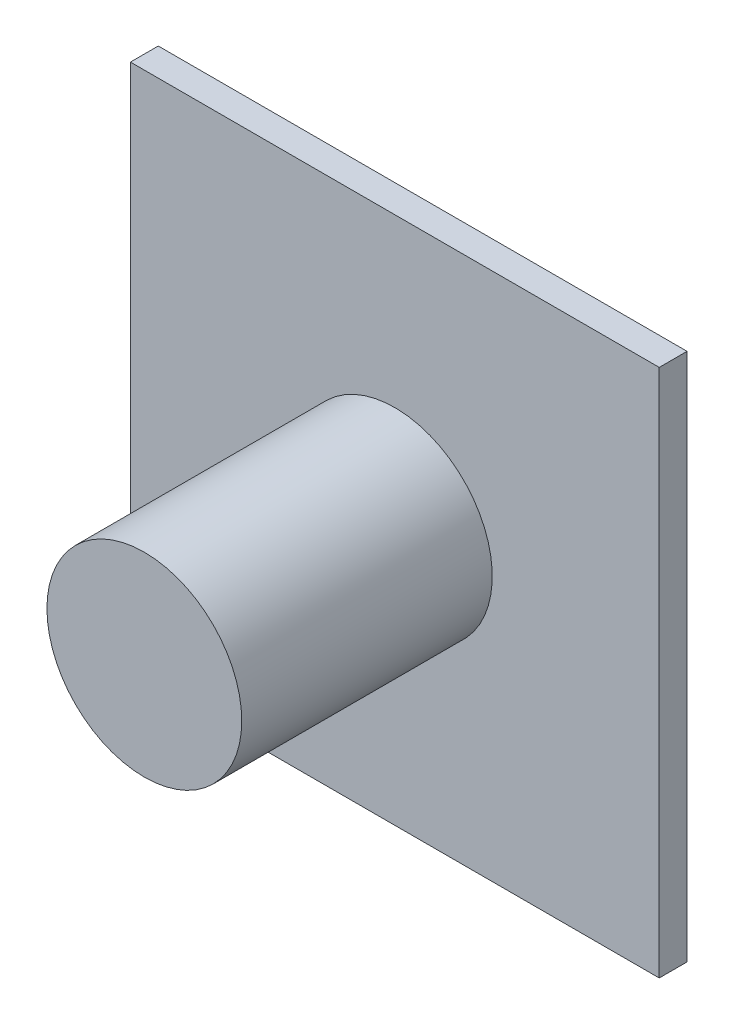
ISO-10303-21;
HEADER;
FILE_DESCRIPTION(('STEP AP214'),'2;1');
FILE_NAME('part.step','',(''),(''),'','','');
FILE_SCHEMA(('AUTOMOTIVE_DESIGN { 1 0 10303 214 1 1 1 1 }'));
ENDSEC;
DATA;
#1=APPLICATION_CONTEXT('core data for automotive mechanical design processes');
#2=APPLICATION_PROTOCOL_DEFINITION('international standard','automotive_design',2000,#1);
#3=PRODUCT_CONTEXT('',#1,'mechanical');
#4=PRODUCT('Part','Part','',(#3));
#5=PRODUCT_RELATED_PRODUCT_CATEGORY('part','',(#4));
#6=PRODUCT_DEFINITION_FORMATION('','',#4);
#7=PRODUCT_DEFINITION_CONTEXT('part definition',#1,'design');
#8=PRODUCT_DEFINITION('design','',#6,#7);
#9=PRODUCT_DEFINITION_SHAPE('','',#8);
#10=(LENGTH_UNIT() NAMED_UNIT(*) SI_UNIT(.MILLI.,.METRE.));
#11=(NAMED_UNIT(*) PLANE_ANGLE_UNIT() SI_UNIT($,.RADIAN.));
#12=(NAMED_UNIT(*) SI_UNIT($,.STERADIAN.) SOLID_ANGLE_UNIT());
#13=UNCERTAINTY_MEASURE_WITH_UNIT(LENGTH_MEASURE(1.E-05),#10,'distance_accuracy_value','');
#14=(GEOMETRIC_REPRESENTATION_CONTEXT(3) GLOBAL_UNCERTAINTY_ASSIGNED_CONTEXT((#13)) GLOBAL_UNIT_ASSIGNED_CONTEXT((#10,
#11,#12)) REPRESENTATION_CONTEXT('',''));
#15=CARTESIAN_POINT('',(0.,0.,0.));
#16=DIRECTION('',(0.,0.,1.));
#17=DIRECTION('',(1.,0.,0.));
#18=AXIS2_PLACEMENT_3D('',#15,#16,#17);
#19=CARTESIAN_POINT('',(19.,-19.,2.));
#20=DIRECTION('',(-1.,0.,0.));
#21=DIRECTION('',(0.,0.,1.));
#22=AXIS2_PLACEMENT_3D('',#19,#20,#21);
#23=PLANE('',#22);
#24=DIRECTION('',(0.,1.,0.));
#25=VECTOR('',#24,1.);
#26=CARTESIAN_POINT('',(19.,-19.,0.));
#27=LINE('',#26,#25);
#28=CARTESIAN_POINT('',(19.,-19.,0.));
#29=VERTEX_POINT('',#28);
#30=CARTESIAN_POINT('',(19.,19.,0.));
#31=VERTEX_POINT('',#30);
#32=EDGE_CURVE('E99',#29,#31,#27,.T.);
#33=ORIENTED_EDGE('',*,*,#32,.T.);
#34=DIRECTION('',(0.,0.,-1.));
#35=VECTOR('',#34,1.);
#36=CARTESIAN_POINT('',(19.,19.,2.));
#37=LINE('',#36,#35);
#38=CARTESIAN_POINT('',(19.,19.,2.));
#39=VERTEX_POINT('',#38);
#40=EDGE_CURVE('E36',#39,#31,#37,.T.);
#41=ORIENTED_EDGE('',*,*,#40,.F.);
#42=DIRECTION('',(0.,1.,0.));
#43=VECTOR('',#42,1.);
#44=CARTESIAN_POINT('',(19.,-19.,2.));
#45=LINE('',#44,#43);
#46=CARTESIAN_POINT('',(19.,-19.,2.));
#47=VERTEX_POINT('',#46);
#48=EDGE_CURVE('E86',#47,#39,#45,.T.);
#49=ORIENTED_EDGE('',*,*,#48,.F.);
#50=DIRECTION('',(0.,0.,-1.));
#51=VECTOR('',#50,1.);
#52=CARTESIAN_POINT('',(19.,-19.,2.));
#53=LINE('',#52,#51);
#54=EDGE_CURVE('E95',#47,#29,#53,.T.);
#55=ORIENTED_EDGE('',*,*,#54,.T.);
#56=EDGE_LOOP('',(#33,#41,#49,#55));
#57=FACE_BOUND('',#56,.T.);
#58=ADVANCED_FACE('F33',(#57),#23,.F.);
#59=CARTESIAN_POINT('',(-19.,19.,2.));
#60=DIRECTION('',(0.,-1.,0.));
#61=DIRECTION('',(0.,0.,-1.));
#62=AXIS2_PLACEMENT_3D('',#59,#60,#61);
#63=PLANE('',#62);
#64=DIRECTION('',(-1.,0.,0.));
#65=VECTOR('',#64,1.);
#66=CARTESIAN_POINT('',(-19.,19.,0.));
#67=LINE('',#66,#65);
#68=CARTESIAN_POINT('',(-19.,19.,0.));
#69=VERTEX_POINT('',#68);
#70=EDGE_CURVE('E91',#31,#69,#67,.T.);
#71=ORIENTED_EDGE('',*,*,#70,.T.);
#72=DIRECTION('',(0.,0.,-1.));
#73=VECTOR('',#72,1.);
#74=CARTESIAN_POINT('',(-19.,19.,2.));
#75=LINE('',#74,#73);
#76=CARTESIAN_POINT('',(-19.,19.,2.));
#77=VERTEX_POINT('',#76);
#78=EDGE_CURVE('E89',#77,#69,#75,.T.);
#79=ORIENTED_EDGE('',*,*,#78,.F.);
#80=DIRECTION('',(-1.,0.,0.));
#81=VECTOR('',#80,1.);
#82=CARTESIAN_POINT('',(-19.,19.,2.));
#83=LINE('',#82,#81);
#84=EDGE_CURVE('E81',#39,#77,#83,.T.);
#85=ORIENTED_EDGE('',*,*,#84,.F.);
#86=ORIENTED_EDGE('',*,*,#40,.T.);
#87=EDGE_LOOP('',(#71,#79,#85,#86));
#88=FACE_BOUND('',#87,.T.);
#89=ADVANCED_FACE('F90',(#88),#63,.F.);
#90=CARTESIAN_POINT('',(-19.,-19.,2.));
#91=DIRECTION('',(1.,0.,0.));
#92=DIRECTION('',(0.,0.,-1.));
#93=AXIS2_PLACEMENT_3D('',#90,#91,#92);
#94=PLANE('',#93);
#95=DIRECTION('',(0.,-1.,0.));
#96=VECTOR('',#95,1.);
#97=CARTESIAN_POINT('',(-19.,-19.,0.));
#98=LINE('',#97,#96);
#99=CARTESIAN_POINT('',(-19.,-19.,0.));
#100=VERTEX_POINT('',#99);
#101=EDGE_CURVE('E67',#69,#100,#98,.T.);
#102=ORIENTED_EDGE('',*,*,#101,.T.);
#103=DIRECTION('',(0.,0.,-1.));
#104=VECTOR('',#103,1.);
#105=CARTESIAN_POINT('',(-19.,-19.,2.));
#106=LINE('',#105,#104);
#107=CARTESIAN_POINT('',(-19.,-19.,2.));
#108=VERTEX_POINT('',#107);
#109=EDGE_CURVE('E92',#108,#100,#106,.T.);
#110=ORIENTED_EDGE('',*,*,#109,.F.);
#111=DIRECTION('',(0.,-1.,0.));
#112=VECTOR('',#111,1.);
#113=CARTESIAN_POINT('',(-19.,-19.,2.));
#114=LINE('',#113,#112);
#115=EDGE_CURVE('E84',#77,#108,#114,.T.);
#116=ORIENTED_EDGE('',*,*,#115,.F.);
#117=ORIENTED_EDGE('',*,*,#78,.T.);
#118=EDGE_LOOP('',(#102,#110,#116,#117));
#119=FACE_BOUND('',#118,.T.);
#120=ADVANCED_FACE('F93',(#119),#94,.F.);
#121=CARTESIAN_POINT('',(-19.,-19.,2.));
#122=DIRECTION('',(0.,1.,0.));
#123=DIRECTION('',(0.,0.,1.));
#124=AXIS2_PLACEMENT_3D('',#121,#122,#123);
#125=PLANE('',#124);
#126=DIRECTION('',(1.,0.,0.));
#127=VECTOR('',#126,1.);
#128=CARTESIAN_POINT('',(-19.,-19.,0.));
#129=LINE('',#128,#127);
#130=EDGE_CURVE('E73',#100,#29,#129,.T.);
#131=ORIENTED_EDGE('',*,*,#130,.T.);
#132=ORIENTED_EDGE('',*,*,#54,.F.);
#133=DIRECTION('',(1.,0.,0.));
#134=VECTOR('',#133,1.);
#135=CARTESIAN_POINT('',(-19.,-19.,2.));
#136=LINE('',#135,#134);
#137=EDGE_CURVE('E50',#108,#47,#136,.T.);
#138=ORIENTED_EDGE('',*,*,#137,.F.);
#139=ORIENTED_EDGE('',*,*,#109,.T.);
#140=EDGE_LOOP('',(#131,#132,#138,#139));
#141=FACE_BOUND('',#140,.T.);
#142=ADVANCED_FACE('F107',(#141),#125,.F.);
#143=CARTESIAN_POINT('',(0.,0.,2.));
#144=DIRECTION('',(0.,0.,-1.));
#145=DIRECTION('',(-1.,0.,0.));
#146=AXIS2_PLACEMENT_3D('',#143,#144,#145);
#147=PLANE('',#146);
#148=CARTESIAN_POINT('',(0.,0.,2.));
#149=DIRECTION('',(0.,0.,-1.));
#150=DIRECTION('',(-1.,0.,0.));
#151=AXIS2_PLACEMENT_3D('',#148,#149,#150);
#152=CIRCLE('',#151,7.);
#153=CARTESIAN_POINT('',(-7.,0.,2.));
#154=VERTEX_POINT('',#153);
#155=EDGE_CURVE('E11',#154,#154,#152,.F.);
#156=ORIENTED_EDGE('',*,*,#155,.F.);
#157=EDGE_LOOP('',(#156));
#158=FACE_BOUND('',#157,.T.);
#159=ORIENTED_EDGE('',*,*,#48,.T.);
#160=ORIENTED_EDGE('',*,*,#84,.T.);
#161=ORIENTED_EDGE('',*,*,#115,.T.);
#162=ORIENTED_EDGE('',*,*,#137,.T.);
#163=EDGE_LOOP('',(#159,#160,#161,#162));
#164=FACE_BOUND('',#163,.T.);
#165=ADVANCED_FACE('F82',(#158,#164),#147,.F.);
#166=CARTESIAN_POINT('',(0.,0.,0.));
#167=DIRECTION('',(0.,0.,-1.));
#168=DIRECTION('',(-1.,0.,0.));
#169=AXIS2_PLACEMENT_3D('',#166,#167,#168);
#170=PLANE('',#169);
#171=ORIENTED_EDGE('',*,*,#32,.F.);
#172=ORIENTED_EDGE('',*,*,#130,.F.);
#173=ORIENTED_EDGE('',*,*,#101,.F.);
#174=ORIENTED_EDGE('',*,*,#70,.F.);
#175=EDGE_LOOP('',(#171,#172,#173,#174));
#176=FACE_BOUND('',#175,.T.);
#177=ADVANCED_FACE('F110',(#176),#170,.T.);
#178=CARTESIAN_POINT('',(0.,0.,20.));
#179=DIRECTION('',(0.,0.,-1.));
#180=DIRECTION('',(-1.,0.,0.));
#181=AXIS2_PLACEMENT_3D('',#178,#179,#180);
#182=CYLINDRICAL_SURFACE('',#181,7.);
#183=CARTESIAN_POINT('',(0.,0.,20.));
#184=DIRECTION('',(0.,0.,1.));
#185=DIRECTION('',(1.,0.,0.));
#186=AXIS2_PLACEMENT_3D('',#183,#184,#185);
#187=CIRCLE('',#186,7.);
#188=CARTESIAN_POINT('',(7.,0.,20.));
#189=VERTEX_POINT('',#188);
#190=EDGE_CURVE('E102',#189,#189,#187,.T.);
#191=ORIENTED_EDGE('',*,*,#190,.F.);
#192=EDGE_LOOP('',(#191));
#193=FACE_BOUND('',#192,.T.);
#194=ORIENTED_EDGE('',*,*,#155,.T.);
#195=EDGE_LOOP('',(#194));
#196=FACE_BOUND('',#195,.T.);
#197=ADVANCED_FACE('F118',(#193,#196),#182,.T.);
#198=CARTESIAN_POINT('',(0.,0.,20.));
#199=DIRECTION('',(0.,0.,1.));
#200=DIRECTION('',(1.,0.,0.));
#201=AXIS2_PLACEMENT_3D('',#198,#199,#200);
#202=PLANE('',#201);
#203=ORIENTED_EDGE('',*,*,#190,.T.);
#204=EDGE_LOOP('',(#203));
#205=FACE_BOUND('',#204,.T.);
#206=ADVANCED_FACE('F116',(#205),#202,.T.);
#207=CLOSED_SHELL('',(#58,#89,#120,#142,#165,#177,#197,#206));
#208=MANIFOLD_SOLID_BREP('B2',#207);
#209=ADVANCED_BREP_SHAPE_REPRESENTATION('',(#18,#208),#14);
#210=SHAPE_DEFINITION_REPRESENTATION(#9,#209);
ENDSEC;
END-ISO-10303-21;
